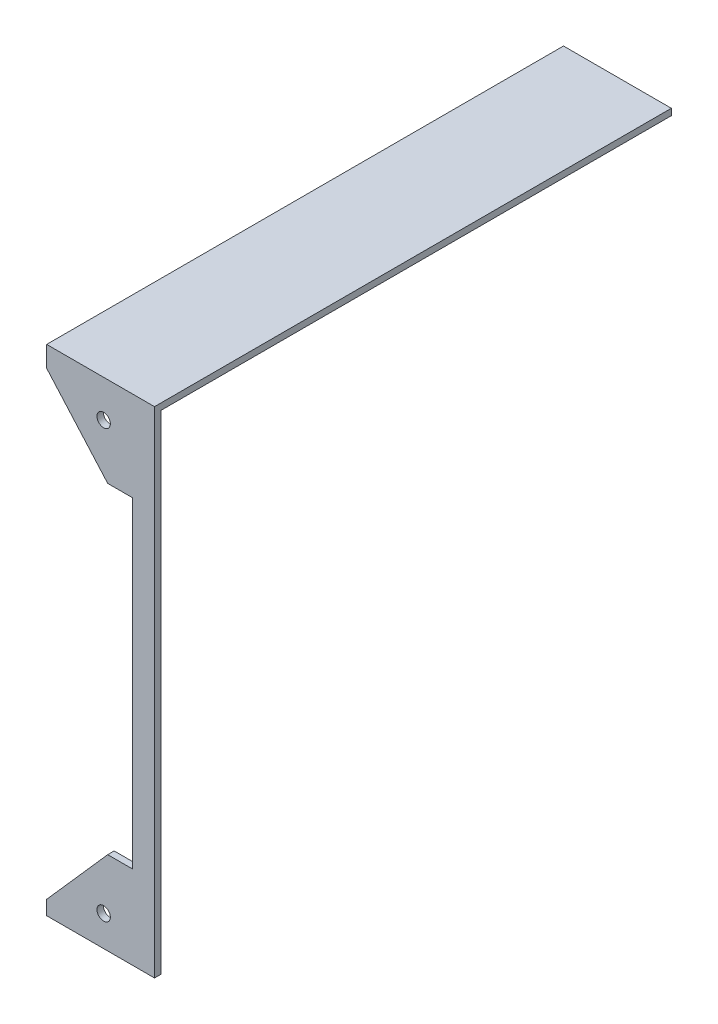
ISO-10303-21;
HEADER;
FILE_DESCRIPTION(('STEP AP214'),'2;1');
FILE_NAME('part.step','',(''),(''),'','','');
FILE_SCHEMA(('AUTOMOTIVE_DESIGN { 1 0 10303 214 1 1 1 1 }'));
ENDSEC;
DATA;
#1=APPLICATION_CONTEXT('core data for automotive mechanical design processes');
#2=APPLICATION_PROTOCOL_DEFINITION('international standard','automotive_design',2000,#1);
#3=PRODUCT_CONTEXT('',#1,'mechanical');
#4=PRODUCT('Part','Part','',(#3));
#5=PRODUCT_RELATED_PRODUCT_CATEGORY('part','',(#4));
#6=PRODUCT_DEFINITION_FORMATION('','',#4);
#7=PRODUCT_DEFINITION_CONTEXT('part definition',#1,'design');
#8=PRODUCT_DEFINITION('design','',#6,#7);
#9=PRODUCT_DEFINITION_SHAPE('','',#8);
#10=(LENGTH_UNIT() NAMED_UNIT(*) SI_UNIT(.MILLI.,.METRE.));
#11=(NAMED_UNIT(*) PLANE_ANGLE_UNIT() SI_UNIT($,.RADIAN.));
#12=(NAMED_UNIT(*) SI_UNIT($,.STERADIAN.) SOLID_ANGLE_UNIT());
#13=UNCERTAINTY_MEASURE_WITH_UNIT(LENGTH_MEASURE(1.E-05),#10,'distance_accuracy_value','');
#14=(GEOMETRIC_REPRESENTATION_CONTEXT(3) GLOBAL_UNCERTAINTY_ASSIGNED_CONTEXT((#13)) GLOBAL_UNIT_ASSIGNED_CONTEXT((#10,
#11,#12)) REPRESENTATION_CONTEXT('',''));
#15=CARTESIAN_POINT('',(0.,0.,0.));
#16=DIRECTION('',(0.,0.,1.));
#17=DIRECTION('',(1.,0.,0.));
#18=AXIS2_PLACEMENT_3D('',#15,#16,#17);
#19=CARTESIAN_POINT('',(0.,0.,1.5875));
#20=DIRECTION('',(0.,0.,-1.));
#21=DIRECTION('',(-1.,0.,0.));
#22=AXIS2_PLACEMENT_3D('',#19,#20,#21);
#23=PLANE('',#22);
#24=DIRECTION('',(0.,1.,0.));
#25=VECTOR('',#24,1.);
#26=CARTESIAN_POINT('',(0.,120.,1.5875));
#27=LINE('',#26,#25);
#28=CARTESIAN_POINT('',(0.,0.,1.5875));
#29=VERTEX_POINT('',#28);
#30=CARTESIAN_POINT('',(0.,121.5875,1.5875));
#31=VERTEX_POINT('',#30);
#32=EDGE_CURVE('E163',#29,#31,#27,.T.);
#33=ORIENTED_EDGE('',*,*,#32,.T.);
#34=DIRECTION('',(1.,0.,0.));
#35=VECTOR('',#34,1.);
#36=CARTESIAN_POINT('',(0.,121.5875,1.5875));
#37=LINE('',#36,#35);
#38=CARTESIAN_POINT('',(-26.5,121.5875,1.5875));
#39=VERTEX_POINT('',#38);
#40=EDGE_CURVE('E225',#39,#31,#37,.T.);
#41=ORIENTED_EDGE('',*,*,#40,.F.);
#42=DIRECTION('',(0.,-1.,0.));
#43=VECTOR('',#42,1.);
#44=CARTESIAN_POINT('',(-26.5,116.5,1.5875));
#45=LINE('',#44,#43);
#46=CARTESIAN_POINT('',(-26.5,116.5,1.5875));
#47=VERTEX_POINT('',#46);
#48=EDGE_CURVE('E103',#39,#47,#45,.T.);
#49=ORIENTED_EDGE('',*,*,#48,.T.);
#50=DIRECTION('',(0.661621637086846,-0.749837855365093,0.));
#51=VECTOR('',#50,1.);
#52=CARTESIAN_POINT('',(-26.5,116.5,1.5875));
#53=LINE('',#52,#51);
#54=CARTESIAN_POINT('',(-11.5,99.5,1.5875));
#55=VERTEX_POINT('',#54);
#56=EDGE_CURVE('E200',#47,#55,#53,.T.);
#57=ORIENTED_EDGE('',*,*,#56,.T.);
#58=DIRECTION('',(1.,0.,0.));
#59=VECTOR('',#58,1.);
#60=CARTESIAN_POINT('',(-11.5,99.5,1.5875));
#61=LINE('',#60,#59);
#62=CARTESIAN_POINT('',(-5.4,99.5,1.5875));
#63=VERTEX_POINT('',#62);
#64=EDGE_CURVE('E179',#55,#63,#61,.T.);
#65=ORIENTED_EDGE('',*,*,#64,.T.);
#66=DIRECTION('',(0.,-1.,0.));
#67=VECTOR('',#66,1.);
#68=CARTESIAN_POINT('',(-5.4,99.5,1.5875));
#69=LINE('',#68,#67);
#70=CARTESIAN_POINT('',(-5.4,20.5,1.5875));
#71=VERTEX_POINT('',#70);
#72=EDGE_CURVE('E196',#63,#71,#69,.T.);
#73=ORIENTED_EDGE('',*,*,#72,.T.);
#74=DIRECTION('',(-1.,0.,0.));
#75=VECTOR('',#74,1.);
#76=CARTESIAN_POINT('',(-5.4,20.5,1.5875));
#77=LINE('',#76,#75);
#78=CARTESIAN_POINT('',(-11.5,20.5,1.5875));
#79=VERTEX_POINT('',#78);
#80=EDGE_CURVE('E125',#71,#79,#77,.T.);
#81=ORIENTED_EDGE('',*,*,#80,.T.);
#82=DIRECTION('',(-0.661621637086846,-0.749837855365093,0.));
#83=VECTOR('',#82,1.);
#84=CARTESIAN_POINT('',(-11.5,20.5,1.5875));
#85=LINE('',#84,#83);
#86=CARTESIAN_POINT('',(-26.5,3.5,1.5875));
#87=VERTEX_POINT('',#86);
#88=EDGE_CURVE('E119',#79,#87,#85,.T.);
#89=ORIENTED_EDGE('',*,*,#88,.T.);
#90=DIRECTION('',(0.,-1.,0.));
#91=VECTOR('',#90,1.);
#92=CARTESIAN_POINT('',(-26.5,3.5,1.5875));
#93=LINE('',#92,#91);
#94=CARTESIAN_POINT('',(-26.5,0.,1.5875));
#95=VERTEX_POINT('',#94);
#96=EDGE_CURVE('E123',#87,#95,#93,.T.);
#97=ORIENTED_EDGE('',*,*,#96,.T.);
#98=DIRECTION('',(1.,0.,0.));
#99=VECTOR('',#98,1.);
#100=CARTESIAN_POINT('',(0.,0.,1.5875));
#101=LINE('',#100,#99);
#102=EDGE_CURVE('E56',#95,#29,#101,.T.);
#103=ORIENTED_EDGE('',*,*,#102,.T.);
#104=EDGE_LOOP('',(#33,#41,#49,#57,#65,#73,#81,#89,#97,#103));
#105=FACE_BOUND('',#104,.T.);
#106=CARTESIAN_POINT('',(-12.5,112.5,1.5875));
#107=DIRECTION('',(0.,0.,1.));
#108=DIRECTION('',(1.,0.,0.));
#109=AXIS2_PLACEMENT_3D('',#106,#107,#108);
#110=CIRCLE('',#109,1.65);
#111=CARTESIAN_POINT('',(-10.85,112.5,1.5875));
#112=VERTEX_POINT('',#111);
#113=EDGE_CURVE('E147',#112,#112,#110,.T.);
#114=ORIENTED_EDGE('',*,*,#113,.F.);
#115=EDGE_LOOP('',(#114));
#116=FACE_BOUND('',#115,.T.);
#117=CARTESIAN_POINT('',(-12.5,7.5,1.5875));
#118=DIRECTION('',(0.,0.,1.));
#119=DIRECTION('',(1.,0.,0.));
#120=AXIS2_PLACEMENT_3D('',#117,#118,#119);
#121=CIRCLE('',#120,1.65);
#122=CARTESIAN_POINT('',(-10.85,7.5,1.5875));
#123=VERTEX_POINT('',#122);
#124=EDGE_CURVE('E207',#123,#123,#121,.T.);
#125=ORIENTED_EDGE('',*,*,#124,.F.);
#126=EDGE_LOOP('',(#125));
#127=FACE_BOUND('',#126,.T.);
#128=ADVANCED_FACE('F39',(#105,#116,#127),#23,.F.);
#129=CARTESIAN_POINT('',(0.,0.,0.));
#130=DIRECTION('',(0.,0.,-1.));
#131=DIRECTION('',(-1.,0.,0.));
#132=AXIS2_PLACEMENT_3D('',#129,#130,#131);
#133=PLANE('',#132);
#134=CARTESIAN_POINT('',(-12.5,112.5,0.));
#135=DIRECTION('',(0.,0.,1.));
#136=DIRECTION('',(1.,0.,0.));
#137=AXIS2_PLACEMENT_3D('',#134,#135,#136);
#138=CIRCLE('',#137,1.65);
#139=CARTESIAN_POINT('',(-10.85,112.5,0.));
#140=VERTEX_POINT('',#139);
#141=EDGE_CURVE('E204',#140,#140,#138,.T.);
#142=ORIENTED_EDGE('',*,*,#141,.T.);
#143=EDGE_LOOP('',(#142));
#144=FACE_BOUND('',#143,.T.);
#145=DIRECTION('',(0.,1.,0.));
#146=VECTOR('',#145,1.);
#147=CARTESIAN_POINT('',(0.,120.,0.));
#148=LINE('',#147,#146);
#149=CARTESIAN_POINT('',(0.,0.,0.));
#150=VERTEX_POINT('',#149);
#151=CARTESIAN_POINT('',(0.,120.,0.));
#152=VERTEX_POINT('',#151);
#153=EDGE_CURVE('E143',#150,#152,#148,.T.);
#154=ORIENTED_EDGE('',*,*,#153,.F.);
#155=DIRECTION('',(1.,0.,0.));
#156=VECTOR('',#155,1.);
#157=CARTESIAN_POINT('',(0.,0.,0.));
#158=LINE('',#157,#156);
#159=CARTESIAN_POINT('',(-26.5,0.,0.));
#160=VERTEX_POINT('',#159);
#161=EDGE_CURVE('E95',#160,#150,#158,.T.);
#162=ORIENTED_EDGE('',*,*,#161,.F.);
#163=DIRECTION('',(0.,-1.,0.));
#164=VECTOR('',#163,1.);
#165=CARTESIAN_POINT('',(-26.5,3.5,0.));
#166=LINE('',#165,#164);
#167=CARTESIAN_POINT('',(-26.5,3.5,0.));
#168=VERTEX_POINT('',#167);
#169=EDGE_CURVE('E89',#168,#160,#166,.T.);
#170=ORIENTED_EDGE('',*,*,#169,.F.);
#171=DIRECTION('',(-0.661621637086846,-0.749837855365093,0.));
#172=VECTOR('',#171,1.);
#173=CARTESIAN_POINT('',(-11.5,20.5,0.));
#174=LINE('',#173,#172);
#175=CARTESIAN_POINT('',(-11.5,20.5,0.));
#176=VERTEX_POINT('',#175);
#177=EDGE_CURVE('E133',#176,#168,#174,.T.);
#178=ORIENTED_EDGE('',*,*,#177,.F.);
#179=DIRECTION('',(-1.,0.,0.));
#180=VECTOR('',#179,1.);
#181=CARTESIAN_POINT('',(-5.4,20.5,0.));
#182=LINE('',#181,#180);
#183=CARTESIAN_POINT('',(-5.4,20.5,0.));
#184=VERTEX_POINT('',#183);
#185=EDGE_CURVE('E158',#184,#176,#182,.T.);
#186=ORIENTED_EDGE('',*,*,#185,.F.);
#187=DIRECTION('',(0.,-1.,0.));
#188=VECTOR('',#187,1.);
#189=CARTESIAN_POINT('',(-5.4,99.5,0.));
#190=LINE('',#189,#188);
#191=CARTESIAN_POINT('',(-5.4,99.5,0.));
#192=VERTEX_POINT('',#191);
#193=EDGE_CURVE('E156',#192,#184,#190,.T.);
#194=ORIENTED_EDGE('',*,*,#193,.F.);
#195=DIRECTION('',(1.,0.,0.));
#196=VECTOR('',#195,1.);
#197=CARTESIAN_POINT('',(-11.5,99.5,0.));
#198=LINE('',#197,#196);
#199=CARTESIAN_POINT('',(-11.5,99.5,0.));
#200=VERTEX_POINT('',#199);
#201=EDGE_CURVE('E154',#200,#192,#198,.T.);
#202=ORIENTED_EDGE('',*,*,#201,.F.);
#203=DIRECTION('',(0.661621637086846,-0.749837855365093,0.));
#204=VECTOR('',#203,1.);
#205=CARTESIAN_POINT('',(-26.5,116.5,0.));
#206=LINE('',#205,#204);
#207=CARTESIAN_POINT('',(-26.5,116.5,0.));
#208=VERTEX_POINT('',#207);
#209=EDGE_CURVE('E152',#208,#200,#206,.T.);
#210=ORIENTED_EDGE('',*,*,#209,.F.);
#211=DIRECTION('',(0.,-1.,0.));
#212=VECTOR('',#211,1.);
#213=CARTESIAN_POINT('',(-26.5,116.5,0.));
#214=LINE('',#213,#212);
#215=CARTESIAN_POINT('',(-26.5,120.,0.));
#216=VERTEX_POINT('',#215);
#217=EDGE_CURVE('E150',#216,#208,#214,.T.);
#218=ORIENTED_EDGE('',*,*,#217,.F.);
#219=DIRECTION('',(-1.,0.,0.));
#220=VECTOR('',#219,1.);
#221=CARTESIAN_POINT('',(-26.5,120.,0.));
#222=LINE('',#221,#220);
#223=EDGE_CURVE('E146',#152,#216,#222,.T.);
#224=ORIENTED_EDGE('',*,*,#223,.F.);
#225=EDGE_LOOP('',(#154,#162,#170,#178,#186,#194,#202,#210,#218,#224));
#226=FACE_BOUND('',#225,.T.);
#227=CARTESIAN_POINT('',(-12.5,7.5,0.));
#228=DIRECTION('',(0.,0.,1.));
#229=DIRECTION('',(1.,0.,0.));
#230=AXIS2_PLACEMENT_3D('',#227,#228,#229);
#231=CIRCLE('',#230,1.65);
#232=CARTESIAN_POINT('',(-10.85,7.5,0.));
#233=VERTEX_POINT('',#232);
#234=EDGE_CURVE('E210',#233,#233,#231,.T.);
#235=ORIENTED_EDGE('',*,*,#234,.T.);
#236=EDGE_LOOP('',(#235));
#237=FACE_BOUND('',#236,.T.);
#238=ADVANCED_FACE('F186',(#144,#226,#237),#133,.T.);
#239=CARTESIAN_POINT('',(0.,120.,1.5875));
#240=DIRECTION('',(-1.,0.,0.));
#241=DIRECTION('',(0.,0.,1.));
#242=AXIS2_PLACEMENT_3D('',#239,#240,#241);
#243=PLANE('',#242);
#244=ORIENTED_EDGE('',*,*,#153,.T.);
#245=DIRECTION('',(0.,0.,-1.));
#246=VECTOR('',#245,1.);
#247=CARTESIAN_POINT('',(0.,120.,1.5875));
#248=LINE('',#247,#246);
#249=CARTESIAN_POINT('',(0.,120.,-125.4125));
#250=VERTEX_POINT('',#249);
#251=EDGE_CURVE('E229',#152,#250,#248,.T.);
#252=ORIENTED_EDGE('',*,*,#251,.T.);
#253=DIRECTION('',(0.,-1.,0.));
#254=VECTOR('',#253,1.);
#255=CARTESIAN_POINT('',(0.,121.5875,-125.4125));
#256=LINE('',#255,#254);
#257=CARTESIAN_POINT('',(0.,121.5875,-125.4125));
#258=VERTEX_POINT('',#257);
#259=EDGE_CURVE('E213',#258,#250,#256,.T.);
#260=ORIENTED_EDGE('',*,*,#259,.F.);
#261=DIRECTION('',(0.,0.,-1.));
#262=VECTOR('',#261,1.);
#263=CARTESIAN_POINT('',(0.,121.5875,1.5875));
#264=LINE('',#263,#262);
#265=EDGE_CURVE('E237',#31,#258,#264,.T.);
#266=ORIENTED_EDGE('',*,*,#265,.F.);
#267=ORIENTED_EDGE('',*,*,#32,.F.);
#268=DIRECTION('',(0.,0.,-1.));
#269=VECTOR('',#268,1.);
#270=CARTESIAN_POINT('',(0.,0.,1.5875));
#271=LINE('',#270,#269);
#272=EDGE_CURVE('E139',#29,#150,#271,.T.);
#273=ORIENTED_EDGE('',*,*,#272,.T.);
#274=EDGE_LOOP('',(#244,#252,#260,#266,#267,#273));
#275=FACE_BOUND('',#274,.T.);
#276=ADVANCED_FACE('F41',(#275),#243,.F.);
#277=CARTESIAN_POINT('',(-26.5,116.5,1.5875));
#278=DIRECTION('',(1.,0.,0.));
#279=DIRECTION('',(0.,1.,0.));
#280=AXIS2_PLACEMENT_3D('',#277,#278,#279);
#281=PLANE('',#280);
#282=ORIENTED_EDGE('',*,*,#217,.T.);
#283=DIRECTION('',(0.,0.,-1.));
#284=VECTOR('',#283,1.);
#285=CARTESIAN_POINT('',(-26.5,116.5,1.5875));
#286=LINE('',#285,#284);
#287=EDGE_CURVE('E11',#47,#208,#286,.T.);
#288=ORIENTED_EDGE('',*,*,#287,.F.);
#289=ORIENTED_EDGE('',*,*,#48,.F.);
#290=DIRECTION('',(0.,0.,1.));
#291=VECTOR('',#290,1.);
#292=CARTESIAN_POINT('',(-26.5,121.5875,-125.4125));
#293=LINE('',#292,#291);
#294=CARTESIAN_POINT('',(-26.5,121.5875,-125.4125));
#295=VERTEX_POINT('',#294);
#296=EDGE_CURVE('E221',#295,#39,#293,.T.);
#297=ORIENTED_EDGE('',*,*,#296,.F.);
#298=DIRECTION('',(0.,-1.,0.));
#299=VECTOR('',#298,1.);
#300=CARTESIAN_POINT('',(-26.5,121.5875,-125.4125));
#301=LINE('',#300,#299);
#302=CARTESIAN_POINT('',(-26.5,120.,-125.4125));
#303=VERTEX_POINT('',#302);
#304=EDGE_CURVE('E218',#295,#303,#301,.T.);
#305=ORIENTED_EDGE('',*,*,#304,.T.);
#306=DIRECTION('',(0.,0.,1.));
#307=VECTOR('',#306,1.);
#308=CARTESIAN_POINT('',(-26.5,120.,-125.4125));
#309=LINE('',#308,#307);
#310=EDGE_CURVE('E222',#303,#216,#309,.T.);
#311=ORIENTED_EDGE('',*,*,#310,.T.);
#312=EDGE_LOOP('',(#282,#288,#289,#297,#305,#311));
#313=FACE_BOUND('',#312,.T.);
#314=ADVANCED_FACE('F267',(#313),#281,.F.);
#315=CARTESIAN_POINT('',(-26.5,116.5,1.5875));
#316=DIRECTION('',(0.749837855365093,0.661621637086846,0.));
#317=DIRECTION('',(-0.661621637086846,0.749837855365093,0.));
#318=AXIS2_PLACEMENT_3D('',#315,#316,#317);
#319=PLANE('',#318);
#320=ORIENTED_EDGE('',*,*,#209,.T.);
#321=DIRECTION('',(0.,0.,-1.));
#322=VECTOR('',#321,1.);
#323=CARTESIAN_POINT('',(-11.5,99.5,1.5875));
#324=LINE('',#323,#322);
#325=EDGE_CURVE('E48',#55,#200,#324,.T.);
#326=ORIENTED_EDGE('',*,*,#325,.F.);
#327=ORIENTED_EDGE('',*,*,#56,.F.);
#328=ORIENTED_EDGE('',*,*,#287,.T.);
#329=EDGE_LOOP('',(#320,#326,#327,#328));
#330=FACE_BOUND('',#329,.T.);
#331=ADVANCED_FACE('F317',(#330),#319,.F.);
#332=CARTESIAN_POINT('',(-11.5,99.5,1.5875));
#333=DIRECTION('',(0.,1.,0.));
#334=DIRECTION('',(0.,0.,1.));
#335=AXIS2_PLACEMENT_3D('',#332,#333,#334);
#336=PLANE('',#335);
#337=ORIENTED_EDGE('',*,*,#201,.T.);
#338=DIRECTION('',(0.,0.,-1.));
#339=VECTOR('',#338,1.);
#340=CARTESIAN_POINT('',(-5.4,99.5,1.5875));
#341=LINE('',#340,#339);
#342=EDGE_CURVE('E170',#63,#192,#341,.T.);
#343=ORIENTED_EDGE('',*,*,#342,.F.);
#344=ORIENTED_EDGE('',*,*,#64,.F.);
#345=ORIENTED_EDGE('',*,*,#325,.T.);
#346=EDGE_LOOP('',(#337,#343,#344,#345));
#347=FACE_BOUND('',#346,.T.);
#348=ADVANCED_FACE('F177',(#347),#336,.F.);
#349=CARTESIAN_POINT('',(-5.4,99.5,1.5875));
#350=DIRECTION('',(1.,0.,0.));
#351=DIRECTION('',(0.,0.,-1.));
#352=AXIS2_PLACEMENT_3D('',#349,#350,#351);
#353=PLANE('',#352);
#354=ORIENTED_EDGE('',*,*,#193,.T.);
#355=DIRECTION('',(0.,0.,-1.));
#356=VECTOR('',#355,1.);
#357=CARTESIAN_POINT('',(-5.4,20.5,1.5875));
#358=LINE('',#357,#356);
#359=EDGE_CURVE('E167',#71,#184,#358,.T.);
#360=ORIENTED_EDGE('',*,*,#359,.F.);
#361=ORIENTED_EDGE('',*,*,#72,.F.);
#362=ORIENTED_EDGE('',*,*,#342,.T.);
#363=EDGE_LOOP('',(#354,#360,#361,#362));
#364=FACE_BOUND('',#363,.T.);
#365=ADVANCED_FACE('F192',(#364),#353,.F.);
#366=CARTESIAN_POINT('',(-5.4,20.5,1.5875));
#367=DIRECTION('',(0.,-1.,0.));
#368=DIRECTION('',(0.,0.,-1.));
#369=AXIS2_PLACEMENT_3D('',#366,#367,#368);
#370=PLANE('',#369);
#371=ORIENTED_EDGE('',*,*,#185,.T.);
#372=DIRECTION('',(0.,0.,-1.));
#373=VECTOR('',#372,1.);
#374=CARTESIAN_POINT('',(-11.5,20.5,1.5875));
#375=LINE('',#374,#373);
#376=EDGE_CURVE('E134',#79,#176,#375,.T.);
#377=ORIENTED_EDGE('',*,*,#376,.F.);
#378=ORIENTED_EDGE('',*,*,#80,.F.);
#379=ORIENTED_EDGE('',*,*,#359,.T.);
#380=EDGE_LOOP('',(#371,#377,#378,#379));
#381=FACE_BOUND('',#380,.T.);
#382=ADVANCED_FACE('F195',(#381),#370,.F.);
#383=CARTESIAN_POINT('',(-11.5,20.5,1.5875));
#384=DIRECTION('',(0.749837855365093,-0.661621637086846,0.));
#385=DIRECTION('',(0.661621637086846,0.749837855365093,0.));
#386=AXIS2_PLACEMENT_3D('',#383,#384,#385);
#387=PLANE('',#386);
#388=ORIENTED_EDGE('',*,*,#177,.T.);
#389=DIRECTION('',(0.,0.,-1.));
#390=VECTOR('',#389,1.);
#391=CARTESIAN_POINT('',(-26.5,3.5,1.5875));
#392=LINE('',#391,#390);
#393=EDGE_CURVE('E130',#87,#168,#392,.T.);
#394=ORIENTED_EDGE('',*,*,#393,.F.);
#395=ORIENTED_EDGE('',*,*,#88,.F.);
#396=ORIENTED_EDGE('',*,*,#376,.T.);
#397=EDGE_LOOP('',(#388,#394,#395,#396));
#398=FACE_BOUND('',#397,.T.);
#399=ADVANCED_FACE('F131',(#398),#387,.F.);
#400=CARTESIAN_POINT('',(-26.5,3.5,1.5875));
#401=DIRECTION('',(1.,0.,0.));
#402=DIRECTION('',(0.,0.,-1.));
#403=AXIS2_PLACEMENT_3D('',#400,#401,#402);
#404=PLANE('',#403);
#405=ORIENTED_EDGE('',*,*,#169,.T.);
#406=DIRECTION('',(0.,0.,-1.));
#407=VECTOR('',#406,1.);
#408=CARTESIAN_POINT('',(-26.5,0.,1.5875));
#409=LINE('',#408,#407);
#410=EDGE_CURVE('E135',#95,#160,#409,.T.);
#411=ORIENTED_EDGE('',*,*,#410,.F.);
#412=ORIENTED_EDGE('',*,*,#96,.F.);
#413=ORIENTED_EDGE('',*,*,#393,.T.);
#414=EDGE_LOOP('',(#405,#411,#412,#413));
#415=FACE_BOUND('',#414,.T.);
#416=ADVANCED_FACE('F137',(#415),#404,.F.);
#417=CARTESIAN_POINT('',(0.,0.,1.5875));
#418=DIRECTION('',(0.,1.,0.));
#419=DIRECTION('',(0.,0.,1.));
#420=AXIS2_PLACEMENT_3D('',#417,#418,#419);
#421=PLANE('',#420);
#422=ORIENTED_EDGE('',*,*,#161,.T.);
#423=ORIENTED_EDGE('',*,*,#272,.F.);
#424=ORIENTED_EDGE('',*,*,#102,.F.);
#425=ORIENTED_EDGE('',*,*,#410,.T.);
#426=EDGE_LOOP('',(#422,#423,#424,#425));
#427=FACE_BOUND('',#426,.T.);
#428=ADVANCED_FACE('F270',(#427),#421,.F.);
#429=CARTESIAN_POINT('',(-12.5,112.5,1.5875));
#430=DIRECTION('',(0.,0.,-1.));
#431=DIRECTION('',(-1.,0.,0.));
#432=AXIS2_PLACEMENT_3D('',#429,#430,#431);
#433=CYLINDRICAL_SURFACE('',#432,1.65);
#434=ORIENTED_EDGE('',*,*,#141,.F.);
#435=EDGE_LOOP('',(#434));
#436=FACE_BOUND('',#435,.T.);
#437=ORIENTED_EDGE('',*,*,#113,.T.);
#438=EDGE_LOOP('',(#437));
#439=FACE_BOUND('',#438,.T.);
#440=ADVANCED_FACE('F272',(#436,#439),#433,.F.);
#441=CARTESIAN_POINT('',(-12.5,7.5,1.5875));
#442=DIRECTION('',(0.,0.,-1.));
#443=DIRECTION('',(-1.,0.,0.));
#444=AXIS2_PLACEMENT_3D('',#441,#442,#443);
#445=CYLINDRICAL_SURFACE('',#444,1.65);
#446=ORIENTED_EDGE('',*,*,#234,.F.);
#447=EDGE_LOOP('',(#446));
#448=FACE_BOUND('',#447,.T.);
#449=ORIENTED_EDGE('',*,*,#124,.T.);
#450=EDGE_LOOP('',(#449));
#451=FACE_BOUND('',#450,.T.);
#452=ADVANCED_FACE('F278',(#448,#451),#445,.F.);
#453=CARTESIAN_POINT('',(0.,120.,0.));
#454=DIRECTION('',(0.,1.,0.));
#455=DIRECTION('',(0.,0.,1.));
#456=AXIS2_PLACEMENT_3D('',#453,#454,#455);
#457=PLANE('',#456);
#458=ORIENTED_EDGE('',*,*,#251,.F.);
#459=ORIENTED_EDGE('',*,*,#223,.T.);
#460=ORIENTED_EDGE('',*,*,#310,.F.);
#461=DIRECTION('',(-1.,0.,0.));
#462=VECTOR('',#461,1.);
#463=CARTESIAN_POINT('',(0.,120.,-125.4125));
#464=LINE('',#463,#462);
#465=EDGE_CURVE('E226',#250,#303,#464,.T.);
#466=ORIENTED_EDGE('',*,*,#465,.F.);
#467=EDGE_LOOP('',(#458,#459,#460,#466));
#468=FACE_BOUND('',#467,.T.);
#469=ADVANCED_FACE('F268',(#468),#457,.F.);
#470=CARTESIAN_POINT('',(0.,121.5875,-125.4125));
#471=DIRECTION('',(0.,0.,1.));
#472=DIRECTION('',(1.,0.,0.));
#473=AXIS2_PLACEMENT_3D('',#470,#471,#472);
#474=PLANE('',#473);
#475=ORIENTED_EDGE('',*,*,#465,.T.);
#476=ORIENTED_EDGE('',*,*,#304,.F.);
#477=DIRECTION('',(-1.,0.,0.));
#478=VECTOR('',#477,1.);
#479=CARTESIAN_POINT('',(0.,121.5875,-125.4125));
#480=LINE('',#479,#478);
#481=EDGE_CURVE('E234',#258,#295,#480,.T.);
#482=ORIENTED_EDGE('',*,*,#481,.F.);
#483=ORIENTED_EDGE('',*,*,#259,.T.);
#484=EDGE_LOOP('',(#475,#476,#482,#483));
#485=FACE_BOUND('',#484,.T.);
#486=ADVANCED_FACE('F262',(#485),#474,.F.);
#487=CARTESIAN_POINT('',(0.,121.5875,0.));
#488=DIRECTION('',(0.,1.,0.));
#489=DIRECTION('',(0.,0.,1.));
#490=AXIS2_PLACEMENT_3D('',#487,#488,#489);
#491=PLANE('',#490);
#492=ORIENTED_EDGE('',*,*,#40,.T.);
#493=ORIENTED_EDGE('',*,*,#265,.T.);
#494=ORIENTED_EDGE('',*,*,#481,.T.);
#495=ORIENTED_EDGE('',*,*,#296,.T.);
#496=EDGE_LOOP('',(#492,#493,#494,#495));
#497=FACE_BOUND('',#496,.T.);
#498=ADVANCED_FACE('F243',(#497),#491,.T.);
#499=CLOSED_SHELL('',(#128,#238,#276,#314,#331,#348,#365,#382,#399,#416,#428,#440,#452,#469,
#486,#498));
#500=MANIFOLD_SOLID_BREP('B2',#499);
#501=ADVANCED_BREP_SHAPE_REPRESENTATION('',(#18,#500),#14);
#502=SHAPE_DEFINITION_REPRESENTATION(#9,#501);
ENDSEC;
END-ISO-10303-21;
